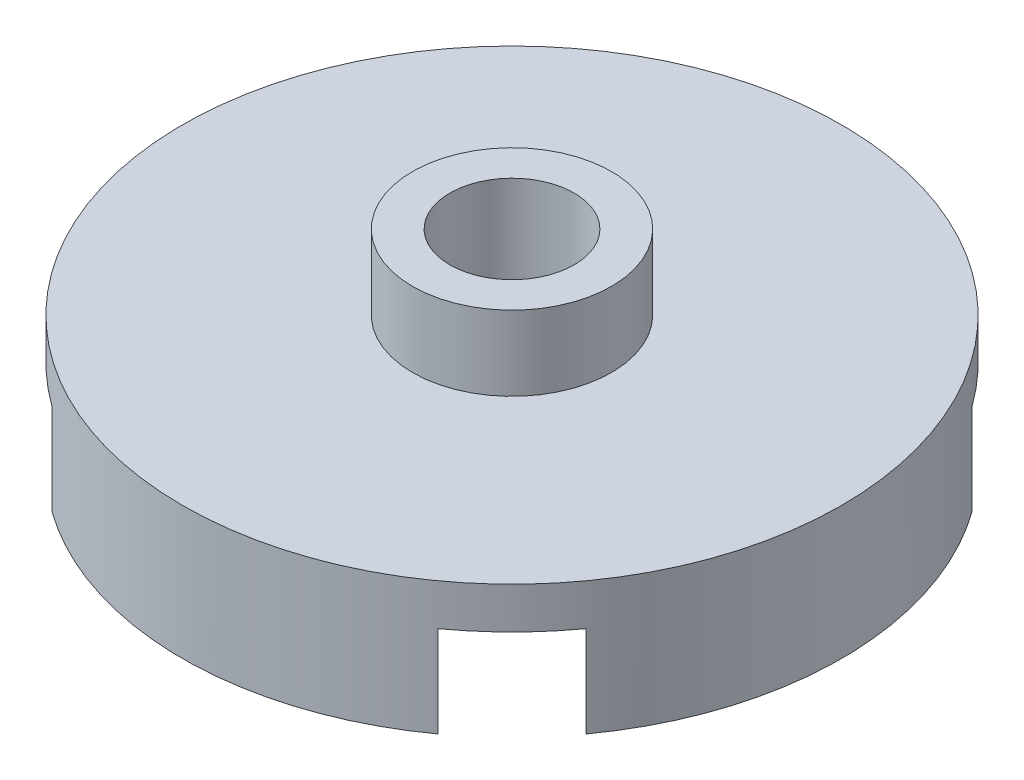
ISO-10303-21;
HEADER;
FILE_DESCRIPTION(('STEP AP214'),'2;1');
FILE_NAME('part.step','',(''),(''),'','','');
FILE_SCHEMA(('AUTOMOTIVE_DESIGN { 1 0 10303 214 1 1 1 1 }'));
ENDSEC;
DATA;
#1=APPLICATION_CONTEXT('core data for automotive mechanical design processes');
#2=APPLICATION_PROTOCOL_DEFINITION('international standard','automotive_design',2000,#1);
#3=PRODUCT_CONTEXT('',#1,'mechanical');
#4=PRODUCT('Part','Part','',(#3));
#5=PRODUCT_RELATED_PRODUCT_CATEGORY('part','',(#4));
#6=PRODUCT_DEFINITION_FORMATION('','',#4);
#7=PRODUCT_DEFINITION_CONTEXT('part definition',#1,'design');
#8=PRODUCT_DEFINITION('design','',#6,#7);
#9=PRODUCT_DEFINITION_SHAPE('','',#8);
#10=(LENGTH_UNIT() NAMED_UNIT(*) SI_UNIT(.MILLI.,.METRE.));
#11=(NAMED_UNIT(*) PLANE_ANGLE_UNIT() SI_UNIT($,.RADIAN.));
#12=(NAMED_UNIT(*) SI_UNIT($,.STERADIAN.) SOLID_ANGLE_UNIT());
#13=UNCERTAINTY_MEASURE_WITH_UNIT(LENGTH_MEASURE(1.E-05),#10,'distance_accuracy_value','');
#14=(GEOMETRIC_REPRESENTATION_CONTEXT(3) GLOBAL_UNCERTAINTY_ASSIGNED_CONTEXT((#13)) GLOBAL_UNIT_ASSIGNED_CONTEXT((#10,
#11,#12)) REPRESENTATION_CONTEXT('',''));
#15=CARTESIAN_POINT('',(0.,0.,0.));
#16=DIRECTION('',(0.,0.,1.));
#17=DIRECTION('',(1.,0.,0.));
#18=AXIS2_PLACEMENT_3D('',#15,#16,#17);
#19=CARTESIAN_POINT('',(0.,3.2,0.));
#20=DIRECTION('',(0.,-1.,0.));
#21=DIRECTION('',(0.,0.,-1.));
#22=AXIS2_PLACEMENT_3D('',#19,#20,#21);
#23=CYLINDRICAL_SURFACE('',#22,7.95000000000001);
#24=CARTESIAN_POINT('',(0.,3.2,0.));
#25=DIRECTION('',(0.,1.,0.));
#26=DIRECTION('',(0.,0.,1.));
#27=AXIS2_PLACEMENT_3D('',#24,#25,#26);
#28=CIRCLE('',#27,7.95000000000001);
#29=CARTESIAN_POINT('',(0.,3.2,7.95000000000001));
#30=VERTEX_POINT('',#29);
#31=EDGE_CURVE('E206',#30,#30,#28,.T.);
#32=ORIENTED_EDGE('',*,*,#31,.F.);
#33=EDGE_LOOP('',(#32));
#34=FACE_BOUND('',#33,.T.);
#35=DIRECTION('',(0.,1.,0.));
#36=VECTOR('',#35,1.);
#37=CARTESIAN_POINT('',(-6.44362582527445,1.1,4.65641345069962));
#38=LINE('',#37,#36);
#39=CARTESIAN_POINT('',(-6.44362582527445,2.2,4.65641345069962));
#40=VERTEX_POINT('',#39);
#41=CARTESIAN_POINT('',(-6.44362582527445,0.,4.65641345069962));
#42=VERTEX_POINT('',#41);
#43=EDGE_CURVE('E256',#40,#42,#38,.F.);
#44=ORIENTED_EDGE('',*,*,#43,.F.);
#45=CARTESIAN_POINT('',(0.,2.2,0.));
#46=DIRECTION('',(0.,-1.,0.));
#47=DIRECTION('',(0.,0.,-1.));
#48=AXIS2_PLACEMENT_3D('',#45,#46,#47);
#49=CIRCLE('',#48,7.95000000000001);
#50=CARTESIAN_POINT('',(-4.65641345069958,2.2,6.44362582527448));
#51=VERTEX_POINT('',#50);
#52=EDGE_CURVE('E264',#51,#40,#49,.T.);
#53=ORIENTED_EDGE('',*,*,#52,.F.);
#54=DIRECTION('',(0.,1.,0.));
#55=VECTOR('',#54,1.);
#56=CARTESIAN_POINT('',(-4.65641345069957,1.1,6.44362582527448));
#57=LINE('',#56,#55);
#58=CARTESIAN_POINT('',(-4.65641345069957,0.,6.44362582527448));
#59=VERTEX_POINT('',#58);
#60=EDGE_CURVE('E253',#59,#51,#57,.T.);
#61=ORIENTED_EDGE('',*,*,#60,.F.);
#62=CARTESIAN_POINT('',(0.,0.,0.));
#63=DIRECTION('',(0.,1.,0.));
#64=DIRECTION('',(0.,0.,1.));
#65=AXIS2_PLACEMENT_3D('',#62,#63,#64);
#66=CIRCLE('',#65,7.95000000000001);
#67=CARTESIAN_POINT('',(4.6564134506996,0.,6.44362582527447));
#68=VERTEX_POINT('',#67);
#69=EDGE_CURVE('E213',#59,#68,#66,.T.);
#70=ORIENTED_EDGE('',*,*,#69,.T.);
#71=DIRECTION('',(0.,1.,0.));
#72=VECTOR('',#71,1.);
#73=CARTESIAN_POINT('',(4.6564134506996,1.1,6.44362582527447));
#74=LINE('',#73,#72);
#75=CARTESIAN_POINT('',(4.6564134506996,2.2,6.44362582527446));
#76=VERTEX_POINT('',#75);
#77=EDGE_CURVE('E65',#76,#68,#74,.F.);
#78=ORIENTED_EDGE('',*,*,#77,.F.);
#79=CARTESIAN_POINT('',(0.,2.2,0.));
#80=DIRECTION('',(0.,-1.,0.));
#81=DIRECTION('',(0.,0.,-1.));
#82=AXIS2_PLACEMENT_3D('',#79,#80,#81);
#83=CIRCLE('',#82,7.95000000000001);
#84=CARTESIAN_POINT('',(6.44362582527446,2.2,4.6564134506996));
#85=VERTEX_POINT('',#84);
#86=EDGE_CURVE('E231',#85,#76,#83,.T.);
#87=ORIENTED_EDGE('',*,*,#86,.F.);
#88=DIRECTION('',(0.,1.,0.));
#89=VECTOR('',#88,1.);
#90=CARTESIAN_POINT('',(6.44362582527447,1.1,4.6564134506996));
#91=LINE('',#90,#89);
#92=CARTESIAN_POINT('',(6.44362582527447,0.,4.6564134506996));
#93=VERTEX_POINT('',#92);
#94=EDGE_CURVE('E230',#93,#85,#91,.T.);
#95=ORIENTED_EDGE('',*,*,#94,.F.);
#96=CARTESIAN_POINT('',(6.44362582527442,0.,-4.65641345069966));
#97=VERTEX_POINT('',#96);
#98=EDGE_CURVE('E220',#93,#97,#66,.T.);
#99=ORIENTED_EDGE('',*,*,#98,.T.);
#100=DIRECTION('',(0.,1.,0.));
#101=VECTOR('',#100,1.);
#102=CARTESIAN_POINT('',(6.44362582527442,1.1,-4.65641345069966));
#103=LINE('',#102,#101);
#104=CARTESIAN_POINT('',(6.44362582527442,2.2,-4.65641345069967));
#105=VERTEX_POINT('',#104);
#106=EDGE_CURVE('E57',#105,#97,#103,.F.);
#107=ORIENTED_EDGE('',*,*,#106,.F.);
#108=CARTESIAN_POINT('',(0.,2.2,0.));
#109=DIRECTION('',(0.,-1.,0.));
#110=DIRECTION('',(0.,0.,-1.));
#111=AXIS2_PLACEMENT_3D('',#108,#109,#110);
#112=CIRCLE('',#111,7.95000000000001);
#113=CARTESIAN_POINT('',(4.65641345069954,2.2,-6.44362582527451));
#114=VERTEX_POINT('',#113);
#115=EDGE_CURVE('E259',#114,#105,#112,.T.);
#116=ORIENTED_EDGE('',*,*,#115,.F.);
#117=DIRECTION('',(0.,1.,0.));
#118=VECTOR('',#117,1.);
#119=CARTESIAN_POINT('',(4.65641345069953,1.1,-6.44362582527452));
#120=LINE('',#119,#118);
#121=CARTESIAN_POINT('',(4.65641345069953,0.,-6.44362582527452));
#122=VERTEX_POINT('',#121);
#123=EDGE_CURVE('E176',#122,#114,#120,.T.);
#124=ORIENTED_EDGE('',*,*,#123,.F.);
#125=CARTESIAN_POINT('',(-4.6564134506996,0.,-6.44362582527447));
#126=VERTEX_POINT('',#125);
#127=EDGE_CURVE('E202',#122,#126,#66,.T.);
#128=ORIENTED_EDGE('',*,*,#127,.T.);
#129=DIRECTION('',(0.,1.,0.));
#130=VECTOR('',#129,1.);
#131=CARTESIAN_POINT('',(-4.6564134506996,1.1,-6.44362582527447));
#132=LINE('',#131,#130);
#133=CARTESIAN_POINT('',(-4.6564134506996,2.2,-6.44362582527446));
#134=VERTEX_POINT('',#133);
#135=EDGE_CURVE('E288',#134,#126,#132,.F.);
#136=ORIENTED_EDGE('',*,*,#135,.F.);
#137=CARTESIAN_POINT('',(0.,2.2,0.));
#138=DIRECTION('',(0.,-1.,0.));
#139=DIRECTION('',(0.,0.,-1.));
#140=AXIS2_PLACEMENT_3D('',#137,#138,#139);
#141=CIRCLE('',#140,7.95000000000001);
#142=CARTESIAN_POINT('',(-6.44362582527446,2.2,-4.6564134506996));
#143=VERTEX_POINT('',#142);
#144=EDGE_CURVE('E291',#143,#134,#141,.T.);
#145=ORIENTED_EDGE('',*,*,#144,.F.);
#146=DIRECTION('',(0.,1.,0.));
#147=VECTOR('',#146,1.);
#148=CARTESIAN_POINT('',(-6.44362582527447,1.1,-4.6564134506996));
#149=LINE('',#148,#147);
#150=CARTESIAN_POINT('',(-6.44362582527447,0.,-4.6564134506996));
#151=VERTEX_POINT('',#150);
#152=EDGE_CURVE('E285',#151,#143,#149,.T.);
#153=ORIENTED_EDGE('',*,*,#152,.F.);
#154=EDGE_CURVE('E210',#151,#42,#66,.T.);
#155=ORIENTED_EDGE('',*,*,#154,.T.);
#156=EDGE_LOOP('',(#44,#53,#61,#70,#78,#87,#95,#99,#107,#116,#124,#128,#136,#145,#153,#155));
#157=FACE_BOUND('',#156,.T.);
#158=ADVANCED_FACE('F41',(#34,#157),#23,.T.);
#159=CARTESIAN_POINT('',(0.,3.2,0.));
#160=DIRECTION('',(0.,-1.,0.));
#161=DIRECTION('',(0.,0.,-1.));
#162=AXIS2_PLACEMENT_3D('',#159,#160,#161);
#163=CYLINDRICAL_SURFACE('',#162,6.95000000000001);
#164=CARTESIAN_POINT('',(0.,2.2,0.));
#165=DIRECTION('',(0.,1.,0.));
#166=DIRECTION('',(0.,0.,1.));
#167=AXIS2_PLACEMENT_3D('',#164,#165,#166);
#168=CIRCLE('',#167,6.95000000000001);
#169=CARTESIAN_POINT('',(-6.27050909954856,2.2,-2.99720129995949));
#170=VERTEX_POINT('',#169);
#171=CARTESIAN_POINT('',(-6.27050909954855,2.2,2.99720129995951));
#172=VERTEX_POINT('',#171);
#173=EDGE_CURVE('E196',#170,#172,#168,.T.);
#174=ORIENTED_EDGE('',*,*,#173,.T.);
#175=DIRECTION('',(0.,1.,0.));
#176=VECTOR('',#175,1.);
#177=CARTESIAN_POINT('',(-6.27050909954855,1.1,2.99720129995951));
#178=LINE('',#177,#176);
#179=CARTESIAN_POINT('',(-6.27050909954855,0.,2.99720129995951));
#180=VERTEX_POINT('',#179);
#181=EDGE_CURVE('E249',#172,#180,#178,.F.);
#182=ORIENTED_EDGE('',*,*,#181,.T.);
#183=CARTESIAN_POINT('',(0.,0.,0.));
#184=DIRECTION('',(0.,1.,0.));
#185=DIRECTION('',(0.,0.,1.));
#186=AXIS2_PLACEMENT_3D('',#183,#184,#185);
#187=CIRCLE('',#186,6.95000000000001);
#188=CARTESIAN_POINT('',(-6.27050909954856,0.,-2.99720129995949));
#189=VERTEX_POINT('',#188);
#190=EDGE_CURVE('E189',#189,#180,#187,.T.);
#191=ORIENTED_EDGE('',*,*,#190,.F.);
#192=DIRECTION('',(0.,1.,0.));
#193=VECTOR('',#192,1.);
#194=CARTESIAN_POINT('',(-6.27050909954856,1.1,-2.99720129995949));
#195=LINE('',#194,#193);
#196=EDGE_CURVE('E277',#189,#170,#195,.T.);
#197=ORIENTED_EDGE('',*,*,#196,.T.);
#198=EDGE_LOOP('',(#174,#182,#191,#197));
#199=FACE_BOUND('',#198,.T.);
#200=ADVANCED_FACE('F336',(#199),#163,.F.);
#201=CARTESIAN_POINT('',(-2.99720129995947,0.,6.27050909954857));
#202=VERTEX_POINT('',#201);
#203=CARTESIAN_POINT('',(2.99720129995949,0.,6.27050909954856));
#204=VERTEX_POINT('',#203);
#205=EDGE_CURVE('E183',#202,#204,#187,.T.);
#206=ORIENTED_EDGE('',*,*,#205,.F.);
#207=DIRECTION('',(0.,1.,0.));
#208=VECTOR('',#207,1.);
#209=CARTESIAN_POINT('',(-2.99720129995947,1.1,6.27050909954857));
#210=LINE('',#209,#208);
#211=CARTESIAN_POINT('',(-2.99720129995947,2.2,6.27050909954857));
#212=VERTEX_POINT('',#211);
#213=EDGE_CURVE('E239',#202,#212,#210,.T.);
#214=ORIENTED_EDGE('',*,*,#213,.T.);
#215=CARTESIAN_POINT('',(2.99720129995949,2.2,6.27050909954856));
#216=VERTEX_POINT('',#215);
#217=EDGE_CURVE('E408',#212,#216,#168,.T.);
#218=ORIENTED_EDGE('',*,*,#217,.T.);
#219=DIRECTION('',(0.,1.,0.));
#220=VECTOR('',#219,1.);
#221=CARTESIAN_POINT('',(2.99720129995949,1.1,6.27050909954856));
#222=LINE('',#221,#220);
#223=EDGE_CURVE('E235',#216,#204,#222,.F.);
#224=ORIENTED_EDGE('',*,*,#223,.T.);
#225=EDGE_LOOP('',(#206,#214,#218,#224));
#226=FACE_BOUND('',#225,.T.);
#227=ADVANCED_FACE('F341',(#226),#163,.F.);
#228=CARTESIAN_POINT('',(6.27050909954856,0.,2.99720129995949));
#229=VERTEX_POINT('',#228);
#230=CARTESIAN_POINT('',(6.27050909954853,0.,-2.99720129995956));
#231=VERTEX_POINT('',#230);
#232=EDGE_CURVE('E172',#229,#231,#187,.T.);
#233=ORIENTED_EDGE('',*,*,#232,.F.);
#234=DIRECTION('',(0.,1.,0.));
#235=VECTOR('',#234,1.);
#236=CARTESIAN_POINT('',(6.27050909954856,1.1,2.99720129995949));
#237=LINE('',#236,#235);
#238=CARTESIAN_POINT('',(6.27050909954856,2.2,2.99720129995949));
#239=VERTEX_POINT('',#238);
#240=EDGE_CURVE('E242',#229,#239,#237,.T.);
#241=ORIENTED_EDGE('',*,*,#240,.T.);
#242=CARTESIAN_POINT('',(6.27050909954853,2.2,-2.99720129995956));
#243=VERTEX_POINT('',#242);
#244=EDGE_CURVE('E174',#239,#243,#168,.T.);
#245=ORIENTED_EDGE('',*,*,#244,.T.);
#246=DIRECTION('',(0.,1.,0.));
#247=VECTOR('',#246,1.);
#248=CARTESIAN_POINT('',(6.27050909954853,1.1,-2.99720129995956));
#249=LINE('',#248,#247);
#250=EDGE_CURVE('E157',#243,#231,#249,.F.);
#251=ORIENTED_EDGE('',*,*,#250,.T.);
#252=EDGE_LOOP('',(#233,#241,#245,#251));
#253=FACE_BOUND('',#252,.T.);
#254=ADVANCED_FACE('F170',(#253),#163,.F.);
#255=CARTESIAN_POINT('',(2.99720129995943,0.,-6.27050909954859));
#256=VERTEX_POINT('',#255);
#257=CARTESIAN_POINT('',(-2.99720129995949,0.,-6.27050909954856));
#258=VERTEX_POINT('',#257);
#259=EDGE_CURVE('E184',#256,#258,#187,.T.);
#260=ORIENTED_EDGE('',*,*,#259,.F.);
#261=DIRECTION('',(0.,1.,0.));
#262=VECTOR('',#261,1.);
#263=CARTESIAN_POINT('',(2.99720129995943,1.1,-6.27050909954859));
#264=LINE('',#263,#262);
#265=CARTESIAN_POINT('',(2.99720129995943,2.2,-6.27050909954859));
#266=VERTEX_POINT('',#265);
#267=EDGE_CURVE('E177',#256,#266,#264,.T.);
#268=ORIENTED_EDGE('',*,*,#267,.T.);
#269=CARTESIAN_POINT('',(-2.99720129995949,2.2,-6.27050909954856));
#270=VERTEX_POINT('',#269);
#271=EDGE_CURVE('E195',#266,#270,#168,.T.);
#272=ORIENTED_EDGE('',*,*,#271,.T.);
#273=DIRECTION('',(0.,1.,0.));
#274=VECTOR('',#273,1.);
#275=CARTESIAN_POINT('',(-2.99720129995949,1.1,-6.27050909954856));
#276=LINE('',#275,#274);
#277=EDGE_CURVE('E281',#270,#258,#276,.F.);
#278=ORIENTED_EDGE('',*,*,#277,.T.);
#279=EDGE_LOOP('',(#260,#268,#272,#278));
#280=FACE_BOUND('',#279,.T.);
#281=ADVANCED_FACE('F343',(#280),#163,.F.);
#282=CARTESIAN_POINT('',(0.,0.,0.));
#283=DIRECTION('',(0.,1.,0.));
#284=DIRECTION('',(0.,0.,1.));
#285=AXIS2_PLACEMENT_3D('',#282,#283,#284);
#286=PLANE('',#285);
#287=CARTESIAN_POINT('',(-4.06586399182263,0.,4.06586399182266));
#288=DIRECTION('',(0.,-1.,0.));
#289=DIRECTION('',(-1.,0.,0.));
#290=AXIS2_PLACEMENT_3D('',#287,#288,#289);
#291=CIRCLE('',#290,2.45);
#292=EDGE_CURVE('E380',#42,#180,#291,.T.);
#293=ORIENTED_EDGE('',*,*,#292,.F.);
#294=ORIENTED_EDGE('',*,*,#154,.F.);
#295=CARTESIAN_POINT('',(-4.06586399182265,0.,-4.06586399182265));
#296=DIRECTION('',(0.,-1.,0.));
#297=DIRECTION('',(0.,0.,-1.));
#298=AXIS2_PLACEMENT_3D('',#295,#296,#297);
#299=CIRCLE('',#298,2.45);
#300=EDGE_CURVE('E272',#189,#151,#299,.T.);
#301=ORIENTED_EDGE('',*,*,#300,.F.);
#302=ORIENTED_EDGE('',*,*,#190,.T.);
#303=EDGE_LOOP('',(#293,#294,#301,#302));
#304=FACE_BOUND('',#303,.T.);
#305=ADVANCED_FACE('F358',(#304),#286,.F.);
#306=CARTESIAN_POINT('',(4.06586399182265,0.,4.06586399182265));
#307=DIRECTION('',(0.,-1.,0.));
#308=DIRECTION('',(0.,0.,1.));
#309=AXIS2_PLACEMENT_3D('',#306,#307,#308);
#310=CIRCLE('',#309,2.45);
#311=EDGE_CURVE('E181',#229,#93,#310,.T.);
#312=ORIENTED_EDGE('',*,*,#311,.F.);
#313=ORIENTED_EDGE('',*,*,#232,.T.);
#314=CARTESIAN_POINT('',(4.06586399182261,0.,-4.06586399182269));
#315=DIRECTION('',(0.,-1.,0.));
#316=DIRECTION('',(1.,0.,0.));
#317=AXIS2_PLACEMENT_3D('',#314,#315,#316);
#318=CIRCLE('',#317,2.45);
#319=EDGE_CURVE('E154',#97,#231,#318,.T.);
#320=ORIENTED_EDGE('',*,*,#319,.F.);
#321=ORIENTED_EDGE('',*,*,#98,.F.);
#322=EDGE_LOOP('',(#312,#313,#320,#321));
#323=FACE_BOUND('',#322,.T.);
#324=ADVANCED_FACE('F180',(#323),#286,.F.);
#325=EDGE_CURVE('E164',#256,#122,#318,.T.);
#326=ORIENTED_EDGE('',*,*,#325,.F.);
#327=ORIENTED_EDGE('',*,*,#259,.T.);
#328=EDGE_CURVE('E268',#126,#258,#299,.T.);
#329=ORIENTED_EDGE('',*,*,#328,.F.);
#330=ORIENTED_EDGE('',*,*,#127,.F.);
#331=EDGE_LOOP('',(#326,#327,#329,#330));
#332=FACE_BOUND('',#331,.T.);
#333=ADVANCED_FACE('F349',(#332),#286,.F.);
#334=CARTESIAN_POINT('',(0.,3.2,0.));
#335=DIRECTION('',(0.,1.,0.));
#336=DIRECTION('',(0.,0.,1.));
#337=AXIS2_PLACEMENT_3D('',#334,#335,#336);
#338=PLANE('',#337);
#339=CARTESIAN_POINT('',(0.,3.2,0.));
#340=DIRECTION('',(0.,1.,0.));
#341=DIRECTION('',(0.,0.,1.));
#342=AXIS2_PLACEMENT_3D('',#339,#340,#341);
#343=CIRCLE('',#342,2.4);
#344=CARTESIAN_POINT('',(0.,3.2,2.4));
#345=VERTEX_POINT('',#344);
#346=EDGE_CURVE('E50',#345,#345,#343,.T.);
#347=ORIENTED_EDGE('',*,*,#346,.F.);
#348=EDGE_LOOP('',(#347));
#349=FACE_BOUND('',#348,.T.);
#350=ORIENTED_EDGE('',*,*,#31,.T.);
#351=EDGE_LOOP('',(#350));
#352=FACE_BOUND('',#351,.T.);
#353=ADVANCED_FACE('F346',(#349,#352),#338,.T.);
#354=EDGE_CURVE('E383',#202,#59,#291,.T.);
#355=ORIENTED_EDGE('',*,*,#354,.F.);
#356=ORIENTED_EDGE('',*,*,#205,.T.);
#357=EDGE_CURVE('E389',#68,#204,#310,.T.);
#358=ORIENTED_EDGE('',*,*,#357,.F.);
#359=ORIENTED_EDGE('',*,*,#69,.F.);
#360=EDGE_LOOP('',(#355,#356,#358,#359));
#361=FACE_BOUND('',#360,.T.);
#362=ADVANCED_FACE('F348',(#361),#286,.F.);
#363=CARTESIAN_POINT('',(0.,5.,0.));
#364=DIRECTION('',(0.,-1.,0.));
#365=DIRECTION('',(0.,0.,-1.));
#366=AXIS2_PLACEMENT_3D('',#363,#364,#365);
#367=CYLINDRICAL_SURFACE('',#366,2.4);
#368=CARTESIAN_POINT('',(0.,5.,0.));
#369=DIRECTION('',(0.,1.,0.));
#370=DIRECTION('',(0.,0.,1.));
#371=AXIS2_PLACEMENT_3D('',#368,#369,#370);
#372=CIRCLE('',#371,2.4);
#373=CARTESIAN_POINT('',(0.,5.,2.4));
#374=VERTEX_POINT('',#373);
#375=EDGE_CURVE('E198',#374,#374,#372,.T.);
#376=ORIENTED_EDGE('',*,*,#375,.F.);
#377=EDGE_LOOP('',(#376));
#378=FACE_BOUND('',#377,.T.);
#379=ORIENTED_EDGE('',*,*,#346,.T.);
#380=EDGE_LOOP('',(#379));
#381=FACE_BOUND('',#380,.T.);
#382=ADVANCED_FACE('F356',(#378,#381),#367,.T.);
#383=CARTESIAN_POINT('',(0.,5.,0.));
#384=DIRECTION('',(0.,1.,0.));
#385=DIRECTION('',(0.,0.,1.));
#386=AXIS2_PLACEMENT_3D('',#383,#384,#385);
#387=PLANE('',#386);
#388=CARTESIAN_POINT('',(0.,5.,0.));
#389=DIRECTION('',(0.,1.,0.));
#390=DIRECTION('',(0.,0.,1.));
#391=AXIS2_PLACEMENT_3D('',#388,#389,#390);
#392=CIRCLE('',#391,1.5);
#393=CARTESIAN_POINT('',(0.,5.,1.5));
#394=VERTEX_POINT('',#393);
#395=EDGE_CURVE('E371',#394,#394,#392,.T.);
#396=ORIENTED_EDGE('',*,*,#395,.F.);
#397=EDGE_LOOP('',(#396));
#398=FACE_BOUND('',#397,.T.);
#399=ORIENTED_EDGE('',*,*,#375,.T.);
#400=EDGE_LOOP('',(#399));
#401=FACE_BOUND('',#400,.T.);
#402=ADVANCED_FACE('F333',(#398,#401),#387,.T.);
#403=CARTESIAN_POINT('',(0.,2.2,0.));
#404=DIRECTION('',(0.,1.,0.));
#405=DIRECTION('',(0.,0.,1.));
#406=AXIS2_PLACEMENT_3D('',#403,#404,#405);
#407=PLANE('',#406);
#408=CARTESIAN_POINT('',(0.,2.2,0.));
#409=DIRECTION('',(0.,1.,0.));
#410=DIRECTION('',(0.,0.,1.));
#411=AXIS2_PLACEMENT_3D('',#408,#409,#410);
#412=CIRCLE('',#411,3.3);
#413=CARTESIAN_POINT('',(0.,2.2,3.3));
#414=VERTEX_POINT('',#413);
#415=EDGE_CURVE('E11',#414,#414,#412,.F.);
#416=ORIENTED_EDGE('',*,*,#415,.F.);
#417=EDGE_LOOP('',(#416));
#418=FACE_BOUND('',#417,.T.);
#419=ORIENTED_EDGE('',*,*,#244,.F.);
#420=CARTESIAN_POINT('',(4.06586399182265,2.2,4.06586399182265));
#421=DIRECTION('',(0.,-1.,0.));
#422=DIRECTION('',(0.,0.,1.));
#423=AXIS2_PLACEMENT_3D('',#420,#421,#422);
#424=CIRCLE('',#423,2.45);
#425=EDGE_CURVE('E392',#239,#85,#424,.T.);
#426=ORIENTED_EDGE('',*,*,#425,.T.);
#427=ORIENTED_EDGE('',*,*,#86,.T.);
#428=EDGE_CURVE('E393',#76,#216,#424,.T.);
#429=ORIENTED_EDGE('',*,*,#428,.T.);
#430=ORIENTED_EDGE('',*,*,#217,.F.);
#431=CARTESIAN_POINT('',(-4.06586399182263,2.2,4.06586399182266));
#432=DIRECTION('',(0.,-1.,0.));
#433=DIRECTION('',(-1.,0.,0.));
#434=AXIS2_PLACEMENT_3D('',#431,#432,#433);
#435=CIRCLE('',#434,2.45);
#436=EDGE_CURVE('E384',#212,#51,#435,.T.);
#437=ORIENTED_EDGE('',*,*,#436,.T.);
#438=ORIENTED_EDGE('',*,*,#52,.T.);
#439=EDGE_CURVE('E385',#40,#172,#435,.T.);
#440=ORIENTED_EDGE('',*,*,#439,.T.);
#441=ORIENTED_EDGE('',*,*,#173,.F.);
#442=CARTESIAN_POINT('',(-4.06586399182265,2.2,-4.06586399182265));
#443=DIRECTION('',(0.,-1.,0.));
#444=DIRECTION('',(0.,0.,-1.));
#445=AXIS2_PLACEMENT_3D('',#442,#443,#444);
#446=CIRCLE('',#445,2.45);
#447=EDGE_CURVE('E273',#170,#143,#446,.T.);
#448=ORIENTED_EDGE('',*,*,#447,.T.);
#449=ORIENTED_EDGE('',*,*,#144,.T.);
#450=EDGE_CURVE('E267',#134,#270,#446,.T.);
#451=ORIENTED_EDGE('',*,*,#450,.T.);
#452=ORIENTED_EDGE('',*,*,#271,.F.);
#453=CARTESIAN_POINT('',(4.06586399182261,2.2,-4.06586399182269));
#454=DIRECTION('',(0.,-1.,0.));
#455=DIRECTION('',(1.,0.,0.));
#456=AXIS2_PLACEMENT_3D('',#453,#454,#455);
#457=CIRCLE('',#456,2.45);
#458=EDGE_CURVE('E165',#266,#114,#457,.T.);
#459=ORIENTED_EDGE('',*,*,#458,.T.);
#460=ORIENTED_EDGE('',*,*,#115,.T.);
#461=EDGE_CURVE('E378',#105,#243,#457,.T.);
#462=ORIENTED_EDGE('',*,*,#461,.T.);
#463=EDGE_LOOP('',(#419,#426,#427,#429,#430,#437,#438,#440,#441,#448,#449,#451,#452,#459,#460,#462));
#464=FACE_BOUND('',#463,.T.);
#465=ADVANCED_FACE('F320',(#418,#464),#407,.F.);
#466=CARTESIAN_POINT('',(0.,-9.33380951166243,0.));
#467=DIRECTION('',(0.,1.,0.));
#468=DIRECTION('',(0.,0.,1.));
#469=AXIS2_PLACEMENT_3D('',#466,#467,#468);
#470=CYLINDRICAL_SURFACE('',#469,3.3);
#471=ORIENTED_EDGE('',*,*,#415,.T.);
#472=EDGE_LOOP('',(#471));
#473=FACE_BOUND('',#472,.T.);
#474=CARTESIAN_POINT('',(0.,0.,0.));
#475=DIRECTION('',(0.,1.,0.));
#476=DIRECTION('',(0.,0.,1.));
#477=AXIS2_PLACEMENT_3D('',#474,#475,#476);
#478=CIRCLE('',#477,3.3);
#479=CARTESIAN_POINT('',(0.,0.,3.3));
#480=VERTEX_POINT('',#479);
#481=EDGE_CURVE('E298',#480,#480,#478,.T.);
#482=ORIENTED_EDGE('',*,*,#481,.T.);
#483=EDGE_LOOP('',(#482));
#484=FACE_BOUND('',#483,.T.);
#485=ADVANCED_FACE('F311',(#473,#484),#470,.T.);
#486=CARTESIAN_POINT('',(0.,-9.33380951166243,0.));
#487=DIRECTION('',(0.,1.,0.));
#488=DIRECTION('',(0.,0.,1.));
#489=AXIS2_PLACEMENT_3D('',#486,#487,#488);
#490=CYLINDRICAL_SURFACE('',#489,2.4);
#491=CARTESIAN_POINT('',(0.,0.,0.));
#492=DIRECTION('',(0.,1.,0.));
#493=DIRECTION('',(0.,0.,1.));
#494=AXIS2_PLACEMENT_3D('',#491,#492,#493);
#495=CIRCLE('',#494,2.4);
#496=CARTESIAN_POINT('',(0.,0.,2.4));
#497=VERTEX_POINT('',#496);
#498=EDGE_CURVE('E190',#497,#497,#495,.T.);
#499=ORIENTED_EDGE('',*,*,#498,.F.);
#500=EDGE_LOOP('',(#499));
#501=FACE_BOUND('',#500,.T.);
#502=CARTESIAN_POINT('',(0.,2.2,0.));
#503=DIRECTION('',(0.,-1.,0.));
#504=DIRECTION('',(0.,0.,-1.));
#505=AXIS2_PLACEMENT_3D('',#502,#503,#504);
#506=CIRCLE('',#505,2.4);
#507=CARTESIAN_POINT('',(0.,2.2,-2.4));
#508=VERTEX_POINT('',#507);
#509=EDGE_CURVE('E294',#508,#508,#506,.T.);
#510=ORIENTED_EDGE('',*,*,#509,.F.);
#511=EDGE_LOOP('',(#510));
#512=FACE_BOUND('',#511,.T.);
#513=ADVANCED_FACE('F308',(#501,#512),#490,.F.);
#514=CARTESIAN_POINT('',(0.,0.,0.));
#515=DIRECTION('',(0.,1.,0.));
#516=DIRECTION('',(0.,0.,1.));
#517=AXIS2_PLACEMENT_3D('',#514,#515,#516);
#518=PLANE('',#517);
#519=ORIENTED_EDGE('',*,*,#498,.T.);
#520=EDGE_LOOP('',(#519));
#521=FACE_BOUND('',#520,.T.);
#522=ORIENTED_EDGE('',*,*,#481,.F.);
#523=EDGE_LOOP('',(#522));
#524=FACE_BOUND('',#523,.T.);
#525=ADVANCED_FACE('F305',(#521,#524),#518,.F.);
#526=CARTESIAN_POINT('',(0.,2.2,0.));
#527=DIRECTION('',(0.,1.,0.));
#528=DIRECTION('',(0.,0.,1.));
#529=AXIS2_PLACEMENT_3D('',#526,#527,#528);
#530=CIRCLE('',#529,1.5);
#531=CARTESIAN_POINT('',(0.,2.2,1.5));
#532=VERTEX_POINT('',#531);
#533=EDGE_CURVE('E44',#532,#532,#530,.T.);
#534=ORIENTED_EDGE('',*,*,#533,.T.);
#535=EDGE_LOOP('',(#534));
#536=FACE_BOUND('',#535,.T.);
#537=ORIENTED_EDGE('',*,*,#509,.T.);
#538=EDGE_LOOP('',(#537));
#539=FACE_BOUND('',#538,.T.);
#540=ADVANCED_FACE('F315',(#536,#539),#407,.F.);
#541=CARTESIAN_POINT('',(-4.06586399182265,0.,-4.06586399182265));
#542=DIRECTION('',(0.,1.,0.));
#543=DIRECTION('',(0.,0.,1.));
#544=AXIS2_PLACEMENT_3D('',#541,#542,#543);
#545=CYLINDRICAL_SURFACE('',#544,2.45);
#546=ORIENTED_EDGE('',*,*,#135,.T.);
#547=ORIENTED_EDGE('',*,*,#328,.T.);
#548=ORIENTED_EDGE('',*,*,#277,.F.);
#549=ORIENTED_EDGE('',*,*,#450,.F.);
#550=EDGE_LOOP('',(#546,#547,#548,#549));
#551=FACE_BOUND('',#550,.T.);
#552=ADVANCED_FACE('F317',(#551),#545,.F.);
#553=ORIENTED_EDGE('',*,*,#152,.T.);
#554=ORIENTED_EDGE('',*,*,#447,.F.);
#555=ORIENTED_EDGE('',*,*,#196,.F.);
#556=ORIENTED_EDGE('',*,*,#300,.T.);
#557=EDGE_LOOP('',(#553,#554,#555,#556));
#558=FACE_BOUND('',#557,.T.);
#559=ADVANCED_FACE('F325',(#558),#545,.F.);
#560=CARTESIAN_POINT('',(4.06586399182261,0.,-4.06586399182269));
#561=DIRECTION('',(0.,1.,0.));
#562=DIRECTION('',(0.,0.,1.));
#563=AXIS2_PLACEMENT_3D('',#560,#561,#562);
#564=CYLINDRICAL_SURFACE('',#563,2.45);
#565=ORIENTED_EDGE('',*,*,#106,.T.);
#566=ORIENTED_EDGE('',*,*,#319,.T.);
#567=ORIENTED_EDGE('',*,*,#250,.F.);
#568=ORIENTED_EDGE('',*,*,#461,.F.);
#569=EDGE_LOOP('',(#565,#566,#567,#568));
#570=FACE_BOUND('',#569,.T.);
#571=ADVANCED_FACE('F156',(#570),#564,.F.);
#572=ORIENTED_EDGE('',*,*,#123,.T.);
#573=ORIENTED_EDGE('',*,*,#458,.F.);
#574=ORIENTED_EDGE('',*,*,#267,.F.);
#575=ORIENTED_EDGE('',*,*,#325,.T.);
#576=EDGE_LOOP('',(#572,#573,#574,#575));
#577=FACE_BOUND('',#576,.T.);
#578=ADVANCED_FACE('F447',(#577),#564,.F.);
#579=CARTESIAN_POINT('',(4.06586399182265,0.,4.06586399182265));
#580=DIRECTION('',(0.,1.,0.));
#581=DIRECTION('',(0.,0.,1.));
#582=AXIS2_PLACEMENT_3D('',#579,#580,#581);
#583=CYLINDRICAL_SURFACE('',#582,2.45);
#584=ORIENTED_EDGE('',*,*,#77,.T.);
#585=ORIENTED_EDGE('',*,*,#357,.T.);
#586=ORIENTED_EDGE('',*,*,#223,.F.);
#587=ORIENTED_EDGE('',*,*,#428,.F.);
#588=EDGE_LOOP('',(#584,#585,#586,#587));
#589=FACE_BOUND('',#588,.T.);
#590=ADVANCED_FACE('F431',(#589),#583,.F.);
#591=ORIENTED_EDGE('',*,*,#94,.T.);
#592=ORIENTED_EDGE('',*,*,#425,.F.);
#593=ORIENTED_EDGE('',*,*,#240,.F.);
#594=ORIENTED_EDGE('',*,*,#311,.T.);
#595=EDGE_LOOP('',(#591,#592,#593,#594));
#596=FACE_BOUND('',#595,.T.);
#597=ADVANCED_FACE('F454',(#596),#583,.F.);
#598=CARTESIAN_POINT('',(-4.06586399182263,0.,4.06586399182266));
#599=DIRECTION('',(0.,1.,0.));
#600=DIRECTION('',(0.,0.,1.));
#601=AXIS2_PLACEMENT_3D('',#598,#599,#600);
#602=CYLINDRICAL_SURFACE('',#601,2.45);
#603=ORIENTED_EDGE('',*,*,#43,.T.);
#604=ORIENTED_EDGE('',*,*,#292,.T.);
#605=ORIENTED_EDGE('',*,*,#181,.F.);
#606=ORIENTED_EDGE('',*,*,#439,.F.);
#607=EDGE_LOOP('',(#603,#604,#605,#606));
#608=FACE_BOUND('',#607,.T.);
#609=ADVANCED_FACE('F424',(#608),#602,.F.);
#610=ORIENTED_EDGE('',*,*,#60,.T.);
#611=ORIENTED_EDGE('',*,*,#436,.F.);
#612=ORIENTED_EDGE('',*,*,#213,.F.);
#613=ORIENTED_EDGE('',*,*,#354,.T.);
#614=EDGE_LOOP('',(#610,#611,#612,#613));
#615=FACE_BOUND('',#614,.T.);
#616=ADVANCED_FACE('F512',(#615),#602,.F.);
#617=CARTESIAN_POINT('',(0.,0.,0.));
#618=DIRECTION('',(0.,1.,0.));
#619=DIRECTION('',(0.,0.,1.));
#620=AXIS2_PLACEMENT_3D('',#617,#618,#619);
#621=CYLINDRICAL_SURFACE('',#620,1.5);
#622=ORIENTED_EDGE('',*,*,#395,.T.);
#623=EDGE_LOOP('',(#622));
#624=FACE_BOUND('',#623,.T.);
#625=ORIENTED_EDGE('',*,*,#533,.F.);
#626=EDGE_LOOP('',(#625));
#627=FACE_BOUND('',#626,.T.);
#628=ADVANCED_FACE('F519',(#624,#627),#621,.F.);
#629=CLOSED_SHELL('',(#158,#200,#227,#254,#281,#305,#324,#333,#353,#362,#382,#402,#465,#485,
#513,#525,#540,#552,#559,#571,#578,#590,#597,#609,#616,#628));
#630=MANIFOLD_SOLID_BREP('B2',#629);
#631=ADVANCED_BREP_SHAPE_REPRESENTATION('',(#18,#630),#14);
#632=SHAPE_DEFINITION_REPRESENTATION(#9,#631);
ENDSEC;
END-ISO-10303-21;
